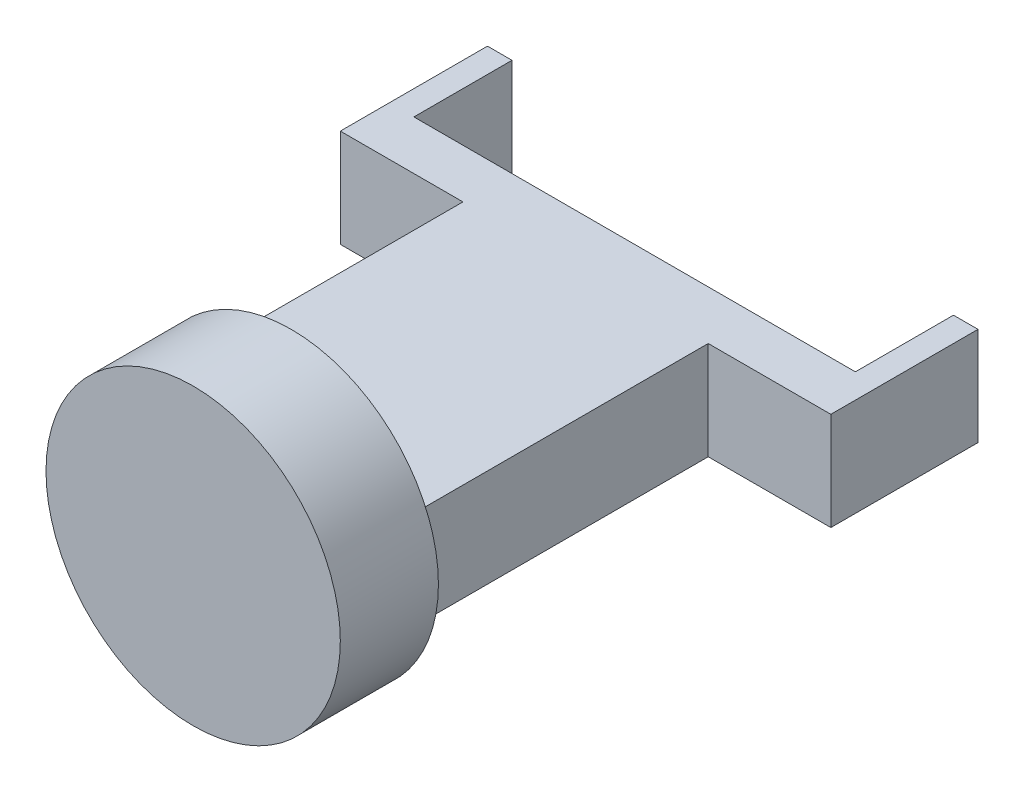
ISO-10303-21;
HEADER;
FILE_DESCRIPTION(('STEP AP214'),'2;1');
FILE_NAME('part.step','',(''),(''),'','','');
FILE_SCHEMA(('AUTOMOTIVE_DESIGN { 1 0 10303 214 1 1 1 1 }'));
ENDSEC;
DATA;
#1=APPLICATION_CONTEXT('core data for automotive mechanical design processes');
#2=APPLICATION_PROTOCOL_DEFINITION('international standard','automotive_design',2000,#1);
#3=PRODUCT_CONTEXT('',#1,'mechanical');
#4=PRODUCT('Part','Part','',(#3));
#5=PRODUCT_RELATED_PRODUCT_CATEGORY('part','',(#4));
#6=PRODUCT_DEFINITION_FORMATION('','',#4);
#7=PRODUCT_DEFINITION_CONTEXT('part definition',#1,'design');
#8=PRODUCT_DEFINITION('design','',#6,#7);
#9=PRODUCT_DEFINITION_SHAPE('','',#8);
#10=(LENGTH_UNIT() NAMED_UNIT(*) SI_UNIT(.MILLI.,.METRE.));
#11=(NAMED_UNIT(*) PLANE_ANGLE_UNIT() SI_UNIT($,.RADIAN.));
#12=(NAMED_UNIT(*) SI_UNIT($,.STERADIAN.) SOLID_ANGLE_UNIT());
#13=UNCERTAINTY_MEASURE_WITH_UNIT(LENGTH_MEASURE(1.E-05),#10,'distance_accuracy_value','');
#14=(GEOMETRIC_REPRESENTATION_CONTEXT(3) GLOBAL_UNCERTAINTY_ASSIGNED_CONTEXT((#13)) GLOBAL_UNIT_ASSIGNED_CONTEXT((#10,
#11,#12)) REPRESENTATION_CONTEXT('',''));
#15=CARTESIAN_POINT('',(0.,0.,0.));
#16=DIRECTION('',(0.,0.,1.));
#17=DIRECTION('',(1.,0.,0.));
#18=AXIS2_PLACEMENT_3D('',#15,#16,#17);
#19=CARTESIAN_POINT('',(0.,0.,-90.));
#20=DIRECTION('',(0.,0.,1.));
#21=DIRECTION('',(1.,0.,0.));
#22=AXIS2_PLACEMENT_3D('',#19,#20,#21);
#23=PLANE('',#22);
#24=DIRECTION('',(0.,-1.,0.));
#25=VECTOR('',#24,1.);
#26=CARTESIAN_POINT('',(-45.,-10.,-90.));
#27=LINE('',#26,#25);
#28=CARTESIAN_POINT('',(-45.,10.,-90.));
#29=VERTEX_POINT('',#28);
#30=CARTESIAN_POINT('',(-45.,-10.,-90.));
#31=VERTEX_POINT('',#30);
#32=EDGE_CURVE('E48',#29,#31,#27,.T.);
#33=ORIENTED_EDGE('',*,*,#32,.F.);
#34=DIRECTION('',(1.,0.,0.));
#35=VECTOR('',#34,1.);
#36=CARTESIAN_POINT('',(50.,10.,-90.));
#37=LINE('',#36,#35);
#38=CARTESIAN_POINT('',(45.,10.,-90.));
#39=VERTEX_POINT('',#38);
#40=EDGE_CURVE('E176',#29,#39,#37,.T.);
#41=ORIENTED_EDGE('',*,*,#40,.T.);
#42=DIRECTION('',(0.,1.,0.));
#43=VECTOR('',#42,1.);
#44=CARTESIAN_POINT('',(45.,-10.,-90.));
#45=LINE('',#44,#43);
#46=CARTESIAN_POINT('',(45.,-10.,-90.));
#47=VERTEX_POINT('',#46);
#48=EDGE_CURVE('E157',#47,#39,#45,.T.);
#49=ORIENTED_EDGE('',*,*,#48,.F.);
#50=DIRECTION('',(-1.,0.,0.));
#51=VECTOR('',#50,1.);
#52=CARTESIAN_POINT('',(50.,-10.,-90.));
#53=LINE('',#52,#51);
#54=EDGE_CURVE('E53',#47,#31,#53,.T.);
#55=ORIENTED_EDGE('',*,*,#54,.T.);
#56=EDGE_LOOP('',(#33,#41,#49,#55));
#57=FACE_BOUND('',#56,.T.);
#58=ADVANCED_FACE('F33',(#57),#23,.F.);
#59=CARTESIAN_POINT('',(0.,0.,-20.));
#60=DIRECTION('',(0.,0.,1.));
#61=DIRECTION('',(1.,0.,0.));
#62=AXIS2_PLACEMENT_3D('',#59,#60,#61);
#63=PLANE('',#62);
#64=CARTESIAN_POINT('',(0.,0.,-20.));
#65=DIRECTION('',(0.,0.,1.));
#66=DIRECTION('',(1.,0.,0.));
#67=AXIS2_PLACEMENT_3D('',#64,#65,#66);
#68=CIRCLE('',#67,30.);
#69=CARTESIAN_POINT('',(30.,0.,-20.));
#70=VERTEX_POINT('',#69);
#71=EDGE_CURVE('E11',#70,#70,#68,.T.);
#72=ORIENTED_EDGE('',*,*,#71,.F.);
#73=EDGE_LOOP('',(#72));
#74=FACE_BOUND('',#73,.T.);
#75=DIRECTION('',(0.,1.,0.));
#76=VECTOR('',#75,1.);
#77=CARTESIAN_POINT('',(-25.,-10.,-20.));
#78=LINE('',#77,#76);
#79=CARTESIAN_POINT('',(-25.,-10.,-20.));
#80=VERTEX_POINT('',#79);
#81=CARTESIAN_POINT('',(-25.,10.,-20.));
#82=VERTEX_POINT('',#81);
#83=EDGE_CURVE('E131',#80,#82,#78,.T.);
#84=ORIENTED_EDGE('',*,*,#83,.F.);
#85=DIRECTION('',(-1.,0.,0.));
#86=VECTOR('',#85,1.);
#87=CARTESIAN_POINT('',(25.,-10.,-20.));
#88=LINE('',#87,#86);
#89=CARTESIAN_POINT('',(25.,-10.,-20.));
#90=VERTEX_POINT('',#89);
#91=EDGE_CURVE('E200',#90,#80,#88,.T.);
#92=ORIENTED_EDGE('',*,*,#91,.F.);
#93=DIRECTION('',(0.,-1.,0.));
#94=VECTOR('',#93,1.);
#95=CARTESIAN_POINT('',(25.,-10.,-20.));
#96=LINE('',#95,#94);
#97=CARTESIAN_POINT('',(25.,10.,-20.));
#98=VERTEX_POINT('',#97);
#99=EDGE_CURVE('E208',#98,#90,#96,.T.);
#100=ORIENTED_EDGE('',*,*,#99,.F.);
#101=DIRECTION('',(1.,0.,0.));
#102=VECTOR('',#101,1.);
#103=CARTESIAN_POINT('',(25.,10.,-20.));
#104=LINE('',#103,#102);
#105=EDGE_CURVE('E206',#82,#98,#104,.T.);
#106=ORIENTED_EDGE('',*,*,#105,.F.);
#107=EDGE_LOOP('',(#84,#92,#100,#106));
#108=FACE_BOUND('',#107,.T.);
#109=ADVANCED_FACE('F229',(#74,#108),#63,.F.);
#110=CARTESIAN_POINT('',(0.,0.,-20.));
#111=DIRECTION('',(0.,0.,1.));
#112=DIRECTION('',(1.,0.,0.));
#113=AXIS2_PLACEMENT_3D('',#110,#111,#112);
#114=CYLINDRICAL_SURFACE('',#113,30.);
#115=ORIENTED_EDGE('',*,*,#71,.T.);
#116=EDGE_LOOP('',(#115));
#117=FACE_BOUND('',#116,.T.);
#118=CARTESIAN_POINT('',(0.,0.,0.));
#119=DIRECTION('',(0.,0.,1.));
#120=DIRECTION('',(1.,0.,0.));
#121=AXIS2_PLACEMENT_3D('',#118,#119,#120);
#122=CIRCLE('',#121,30.);
#123=CARTESIAN_POINT('',(30.,0.,0.));
#124=VERTEX_POINT('',#123);
#125=EDGE_CURVE('E37',#124,#124,#122,.T.);
#126=ORIENTED_EDGE('',*,*,#125,.F.);
#127=EDGE_LOOP('',(#126));
#128=FACE_BOUND('',#127,.T.);
#129=ADVANCED_FACE('F35',(#117,#128),#114,.T.);
#130=CARTESIAN_POINT('',(0.,0.,0.));
#131=DIRECTION('',(0.,0.,1.));
#132=DIRECTION('',(1.,0.,0.));
#133=AXIS2_PLACEMENT_3D('',#130,#131,#132);
#134=PLANE('',#133);
#135=ORIENTED_EDGE('',*,*,#125,.T.);
#136=EDGE_LOOP('',(#135));
#137=FACE_BOUND('',#136,.T.);
#138=ADVANCED_FACE('F226',(#137),#134,.T.);
#139=CARTESIAN_POINT('',(-25.,-10.,-80.));
#140=DIRECTION('',(1.,0.,0.));
#141=DIRECTION('',(0.,0.,-1.));
#142=AXIS2_PLACEMENT_3D('',#139,#140,#141);
#143=PLANE('',#142);
#144=ORIENTED_EDGE('',*,*,#83,.T.);
#145=DIRECTION('',(0.,0.,1.));
#146=VECTOR('',#145,1.);
#147=CARTESIAN_POINT('',(-25.,10.,-80.));
#148=LINE('',#147,#146);
#149=CARTESIAN_POINT('',(-25.,10.,-80.));
#150=VERTEX_POINT('',#149);
#151=EDGE_CURVE('E221',#150,#82,#148,.T.);
#152=ORIENTED_EDGE('',*,*,#151,.F.);
#153=DIRECTION('',(0.,1.,0.));
#154=VECTOR('',#153,1.);
#155=CARTESIAN_POINT('',(-25.,-10.,-80.));
#156=LINE('',#155,#154);
#157=CARTESIAN_POINT('',(-25.,-10.,-80.));
#158=VERTEX_POINT('',#157);
#159=EDGE_CURVE('E196',#158,#150,#156,.T.);
#160=ORIENTED_EDGE('',*,*,#159,.F.);
#161=DIRECTION('',(0.,0.,1.));
#162=VECTOR('',#161,1.);
#163=CARTESIAN_POINT('',(-25.,-10.,-80.));
#164=LINE('',#163,#162);
#165=EDGE_CURVE('E203',#158,#80,#164,.T.);
#166=ORIENTED_EDGE('',*,*,#165,.T.);
#167=EDGE_LOOP('',(#144,#152,#160,#166));
#168=FACE_BOUND('',#167,.T.);
#169=ADVANCED_FACE('F235',(#168),#143,.F.);
#170=CARTESIAN_POINT('',(25.,10.,-80.));
#171=DIRECTION('',(0.,-1.,0.));
#172=DIRECTION('',(0.,0.,-1.));
#173=AXIS2_PLACEMENT_3D('',#170,#171,#172);
#174=PLANE('',#173);
#175=ORIENTED_EDGE('',*,*,#105,.T.);
#176=DIRECTION('',(0.,0.,1.));
#177=VECTOR('',#176,1.);
#178=CARTESIAN_POINT('',(25.,10.,-80.));
#179=LINE('',#178,#177);
#180=CARTESIAN_POINT('',(25.,10.,-80.));
#181=VERTEX_POINT('',#180);
#182=EDGE_CURVE('E218',#181,#98,#179,.T.);
#183=ORIENTED_EDGE('',*,*,#182,.F.);
#184=DIRECTION('',(1.,0.,0.));
#185=VECTOR('',#184,1.);
#186=CARTESIAN_POINT('',(50.,10.,-80.));
#187=LINE('',#186,#185);
#188=CARTESIAN_POINT('',(50.,10.,-80.));
#189=VERTEX_POINT('',#188);
#190=EDGE_CURVE('E182',#181,#189,#187,.T.);
#191=ORIENTED_EDGE('',*,*,#190,.T.);
#192=DIRECTION('',(0.,0.,1.));
#193=VECTOR('',#192,1.);
#194=CARTESIAN_POINT('',(50.,10.,-90.));
#195=LINE('',#194,#193);
#196=CARTESIAN_POINT('',(50.,10.,-110.));
#197=VERTEX_POINT('',#196);
#198=EDGE_CURVE('E132',#197,#189,#195,.T.);
#199=ORIENTED_EDGE('',*,*,#198,.F.);
#200=DIRECTION('',(1.,0.,0.));
#201=VECTOR('',#200,1.);
#202=CARTESIAN_POINT('',(45.,10.,-110.));
#203=LINE('',#202,#201);
#204=CARTESIAN_POINT('',(45.,10.,-110.));
#205=VERTEX_POINT('',#204);
#206=EDGE_CURVE('E165',#205,#197,#203,.T.);
#207=ORIENTED_EDGE('',*,*,#206,.F.);
#208=DIRECTION('',(0.,0.,1.));
#209=VECTOR('',#208,1.);
#210=CARTESIAN_POINT('',(45.,10.,-110.));
#211=LINE('',#210,#209);
#212=EDGE_CURVE('E168',#205,#39,#211,.T.);
#213=ORIENTED_EDGE('',*,*,#212,.T.);
#214=ORIENTED_EDGE('',*,*,#40,.F.);
#215=DIRECTION('',(0.,0.,1.));
#216=VECTOR('',#215,1.);
#217=CARTESIAN_POINT('',(-45.,10.,-110.));
#218=LINE('',#217,#216);
#219=CARTESIAN_POINT('',(-45.,10.,-110.));
#220=VERTEX_POINT('',#219);
#221=EDGE_CURVE('E139',#220,#29,#218,.T.);
#222=ORIENTED_EDGE('',*,*,#221,.F.);
#223=DIRECTION('',(1.,0.,0.));
#224=VECTOR('',#223,1.);
#225=CARTESIAN_POINT('',(-45.,10.,-110.));
#226=LINE('',#225,#224);
#227=CARTESIAN_POINT('',(-50.,10.,-110.));
#228=VERTEX_POINT('',#227);
#229=EDGE_CURVE('E135',#228,#220,#226,.T.);
#230=ORIENTED_EDGE('',*,*,#229,.F.);
#231=DIRECTION('',(0.,0.,1.));
#232=VECTOR('',#231,1.);
#233=CARTESIAN_POINT('',(-50.,10.,-90.));
#234=LINE('',#233,#232);
#235=CARTESIAN_POINT('',(-50.,10.,-80.));
#236=VERTEX_POINT('',#235);
#237=EDGE_CURVE('E121',#228,#236,#234,.T.);
#238=ORIENTED_EDGE('',*,*,#237,.T.);
#239=EDGE_CURVE('E183',#236,#150,#187,.T.);
#240=ORIENTED_EDGE('',*,*,#239,.T.);
#241=ORIENTED_EDGE('',*,*,#151,.T.);
#242=EDGE_LOOP('',(#175,#183,#191,#199,#207,#213,#214,#222,#230,#238,#240,#241));
#243=FACE_BOUND('',#242,.T.);
#244=ADVANCED_FACE('F137',(#243),#174,.F.);
#245=CARTESIAN_POINT('',(25.,-10.,-80.));
#246=DIRECTION('',(-1.,0.,0.));
#247=DIRECTION('',(0.,0.,1.));
#248=AXIS2_PLACEMENT_3D('',#245,#246,#247);
#249=PLANE('',#248);
#250=ORIENTED_EDGE('',*,*,#99,.T.);
#251=DIRECTION('',(0.,0.,1.));
#252=VECTOR('',#251,1.);
#253=CARTESIAN_POINT('',(25.,-10.,-80.));
#254=LINE('',#253,#252);
#255=CARTESIAN_POINT('',(25.,-10.,-80.));
#256=VERTEX_POINT('',#255);
#257=EDGE_CURVE('E215',#256,#90,#254,.T.);
#258=ORIENTED_EDGE('',*,*,#257,.F.);
#259=DIRECTION('',(0.,-1.,0.));
#260=VECTOR('',#259,1.);
#261=CARTESIAN_POINT('',(25.,-10.,-80.));
#262=LINE('',#261,#260);
#263=EDGE_CURVE('E199',#181,#256,#262,.T.);
#264=ORIENTED_EDGE('',*,*,#263,.F.);
#265=ORIENTED_EDGE('',*,*,#182,.T.);
#266=EDGE_LOOP('',(#250,#258,#264,#265));
#267=FACE_BOUND('',#266,.T.);
#268=ADVANCED_FACE('F260',(#267),#249,.F.);
#269=CARTESIAN_POINT('',(25.,-10.,-80.));
#270=DIRECTION('',(0.,1.,0.));
#271=DIRECTION('',(0.,0.,1.));
#272=AXIS2_PLACEMENT_3D('',#269,#270,#271);
#273=PLANE('',#272);
#274=ORIENTED_EDGE('',*,*,#91,.T.);
#275=ORIENTED_EDGE('',*,*,#165,.F.);
#276=DIRECTION('',(-1.,0.,0.));
#277=VECTOR('',#276,1.);
#278=CARTESIAN_POINT('',(50.,-10.,-80.));
#279=LINE('',#278,#277);
#280=CARTESIAN_POINT('',(-50.,-10.,-80.));
#281=VERTEX_POINT('',#280);
#282=EDGE_CURVE('E187',#158,#281,#279,.T.);
#283=ORIENTED_EDGE('',*,*,#282,.T.);
#284=DIRECTION('',(0.,0.,1.));
#285=VECTOR('',#284,1.);
#286=CARTESIAN_POINT('',(-50.,-10.,-90.));
#287=LINE('',#286,#285);
#288=CARTESIAN_POINT('',(-50.,-10.,-110.));
#289=VERTEX_POINT('',#288);
#290=EDGE_CURVE('E180',#289,#281,#287,.T.);
#291=ORIENTED_EDGE('',*,*,#290,.F.);
#292=DIRECTION('',(-1.,0.,0.));
#293=VECTOR('',#292,1.);
#294=CARTESIAN_POINT('',(-50.,-10.,-110.));
#295=LINE('',#294,#293);
#296=CARTESIAN_POINT('',(-45.,-10.,-110.));
#297=VERTEX_POINT('',#296);
#298=EDGE_CURVE('E147',#297,#289,#295,.T.);
#299=ORIENTED_EDGE('',*,*,#298,.F.);
#300=DIRECTION('',(0.,0.,1.));
#301=VECTOR('',#300,1.);
#302=CARTESIAN_POINT('',(-45.,-10.,-110.));
#303=LINE('',#302,#301);
#304=EDGE_CURVE('E152',#297,#31,#303,.T.);
#305=ORIENTED_EDGE('',*,*,#304,.T.);
#306=ORIENTED_EDGE('',*,*,#54,.F.);
#307=DIRECTION('',(0.,0.,1.));
#308=VECTOR('',#307,1.);
#309=CARTESIAN_POINT('',(45.,-10.,-110.));
#310=LINE('',#309,#308);
#311=CARTESIAN_POINT('',(45.,-10.,-110.));
#312=VERTEX_POINT('',#311);
#313=EDGE_CURVE('E173',#312,#47,#310,.T.);
#314=ORIENTED_EDGE('',*,*,#313,.F.);
#315=DIRECTION('',(-1.,0.,0.));
#316=VECTOR('',#315,1.);
#317=CARTESIAN_POINT('',(50.,-10.,-110.));
#318=LINE('',#317,#316);
#319=CARTESIAN_POINT('',(50.,-10.,-110.));
#320=VERTEX_POINT('',#319);
#321=EDGE_CURVE('E161',#320,#312,#318,.T.);
#322=ORIENTED_EDGE('',*,*,#321,.F.);
#323=DIRECTION('',(0.,0.,1.));
#324=VECTOR('',#323,1.);
#325=CARTESIAN_POINT('',(50.,-10.,-90.));
#326=LINE('',#325,#324);
#327=CARTESIAN_POINT('',(50.,-10.,-80.));
#328=VERTEX_POINT('',#327);
#329=EDGE_CURVE('E191',#320,#328,#326,.T.);
#330=ORIENTED_EDGE('',*,*,#329,.T.);
#331=EDGE_CURVE('E178',#328,#256,#279,.T.);
#332=ORIENTED_EDGE('',*,*,#331,.T.);
#333=ORIENTED_EDGE('',*,*,#257,.T.);
#334=EDGE_LOOP('',(#274,#275,#283,#291,#299,#305,#306,#314,#322,#330,#332,#333));
#335=FACE_BOUND('',#334,.T.);
#336=ADVANCED_FACE('F257',(#335),#273,.F.);
#337=CARTESIAN_POINT('',(0.,0.,-80.));
#338=DIRECTION('',(0.,0.,1.));
#339=DIRECTION('',(1.,0.,0.));
#340=AXIS2_PLACEMENT_3D('',#337,#338,#339);
#341=PLANE('',#340);
#342=ORIENTED_EDGE('',*,*,#282,.F.);
#343=ORIENTED_EDGE('',*,*,#159,.T.);
#344=ORIENTED_EDGE('',*,*,#239,.F.);
#345=DIRECTION('',(0.,1.,0.));
#346=VECTOR('',#345,1.);
#347=CARTESIAN_POINT('',(-50.,-10.,-80.));
#348=LINE('',#347,#346);
#349=EDGE_CURVE('E128',#281,#236,#348,.T.);
#350=ORIENTED_EDGE('',*,*,#349,.F.);
#351=EDGE_LOOP('',(#342,#343,#344,#350));
#352=FACE_BOUND('',#351,.T.);
#353=ADVANCED_FACE('F251',(#352),#341,.T.);
#354=CARTESIAN_POINT('',(-50.,-10.,-90.));
#355=DIRECTION('',(1.,0.,0.));
#356=DIRECTION('',(0.,0.,-1.));
#357=AXIS2_PLACEMENT_3D('',#354,#355,#356);
#358=PLANE('',#357);
#359=ORIENTED_EDGE('',*,*,#349,.T.);
#360=ORIENTED_EDGE('',*,*,#237,.F.);
#361=DIRECTION('',(0.,1.,0.));
#362=VECTOR('',#361,1.);
#363=CARTESIAN_POINT('',(-50.,10.,-110.));
#364=LINE('',#363,#362);
#365=EDGE_CURVE('E126',#289,#228,#364,.T.);
#366=ORIENTED_EDGE('',*,*,#365,.F.);
#367=ORIENTED_EDGE('',*,*,#290,.T.);
#368=EDGE_LOOP('',(#359,#360,#366,#367));
#369=FACE_BOUND('',#368,.T.);
#370=ADVANCED_FACE('F123',(#369),#358,.F.);
#371=CARTESIAN_POINT('',(50.,-10.,-90.));
#372=DIRECTION('',(-1.,0.,0.));
#373=DIRECTION('',(0.,0.,1.));
#374=AXIS2_PLACEMENT_3D('',#371,#372,#373);
#375=PLANE('',#374);
#376=DIRECTION('',(0.,-1.,0.));
#377=VECTOR('',#376,1.);
#378=CARTESIAN_POINT('',(50.,-10.,-80.));
#379=LINE('',#378,#377);
#380=EDGE_CURVE('E185',#189,#328,#379,.T.);
#381=ORIENTED_EDGE('',*,*,#380,.T.);
#382=ORIENTED_EDGE('',*,*,#329,.F.);
#383=DIRECTION('',(0.,-1.,0.));
#384=VECTOR('',#383,1.);
#385=CARTESIAN_POINT('',(50.,10.,-110.));
#386=LINE('',#385,#384);
#387=EDGE_CURVE('E158',#197,#320,#386,.T.);
#388=ORIENTED_EDGE('',*,*,#387,.F.);
#389=ORIENTED_EDGE('',*,*,#198,.T.);
#390=EDGE_LOOP('',(#381,#382,#388,#389));
#391=FACE_BOUND('',#390,.T.);
#392=ADVANCED_FACE('F249',(#391),#375,.F.);
#393=ORIENTED_EDGE('',*,*,#190,.F.);
#394=ORIENTED_EDGE('',*,*,#263,.T.);
#395=ORIENTED_EDGE('',*,*,#331,.F.);
#396=ORIENTED_EDGE('',*,*,#380,.F.);
#397=EDGE_LOOP('',(#393,#394,#395,#396));
#398=FACE_BOUND('',#397,.T.);
#399=ADVANCED_FACE('F246',(#398),#341,.T.);
#400=CARTESIAN_POINT('',(45.,-10.,-110.));
#401=DIRECTION('',(1.,0.,0.));
#402=DIRECTION('',(0.,0.,-1.));
#403=AXIS2_PLACEMENT_3D('',#400,#401,#402);
#404=PLANE('',#403);
#405=ORIENTED_EDGE('',*,*,#48,.T.);
#406=ORIENTED_EDGE('',*,*,#212,.F.);
#407=DIRECTION('',(0.,1.,0.));
#408=VECTOR('',#407,1.);
#409=CARTESIAN_POINT('',(45.,-10.,-110.));
#410=LINE('',#409,#408);
#411=EDGE_CURVE('E163',#312,#205,#410,.T.);
#412=ORIENTED_EDGE('',*,*,#411,.F.);
#413=ORIENTED_EDGE('',*,*,#313,.T.);
#414=EDGE_LOOP('',(#405,#406,#412,#413));
#415=FACE_BOUND('',#414,.T.);
#416=ADVANCED_FACE('F244',(#415),#404,.F.);
#417=CARTESIAN_POINT('',(0.,0.,-110.));
#418=DIRECTION('',(0.,0.,-1.));
#419=DIRECTION('',(-1.,0.,0.));
#420=AXIS2_PLACEMENT_3D('',#417,#418,#419);
#421=PLANE('',#420);
#422=ORIENTED_EDGE('',*,*,#387,.T.);
#423=ORIENTED_EDGE('',*,*,#321,.T.);
#424=ORIENTED_EDGE('',*,*,#411,.T.);
#425=ORIENTED_EDGE('',*,*,#206,.T.);
#426=EDGE_LOOP('',(#422,#423,#424,#425));
#427=FACE_BOUND('',#426,.T.);
#428=ADVANCED_FACE('F281',(#427),#421,.T.);
#429=CARTESIAN_POINT('',(-45.,-10.,-110.));
#430=DIRECTION('',(-1.,0.,0.));
#431=DIRECTION('',(0.,0.,1.));
#432=AXIS2_PLACEMENT_3D('',#429,#430,#431);
#433=PLANE('',#432);
#434=ORIENTED_EDGE('',*,*,#32,.T.);
#435=ORIENTED_EDGE('',*,*,#304,.F.);
#436=DIRECTION('',(0.,-1.,0.));
#437=VECTOR('',#436,1.);
#438=CARTESIAN_POINT('',(-45.,-10.,-110.));
#439=LINE('',#438,#437);
#440=EDGE_CURVE('E142',#220,#297,#439,.T.);
#441=ORIENTED_EDGE('',*,*,#440,.F.);
#442=ORIENTED_EDGE('',*,*,#221,.T.);
#443=EDGE_LOOP('',(#434,#435,#441,#442));
#444=FACE_BOUND('',#443,.T.);
#445=ADVANCED_FACE('F288',(#444),#433,.F.);
#446=CARTESIAN_POINT('',(0.,0.,-110.));
#447=DIRECTION('',(0.,0.,1.));
#448=DIRECTION('',(1.,0.,0.));
#449=AXIS2_PLACEMENT_3D('',#446,#447,#448);
#450=PLANE('',#449);
#451=ORIENTED_EDGE('',*,*,#365,.T.);
#452=ORIENTED_EDGE('',*,*,#229,.T.);
#453=ORIENTED_EDGE('',*,*,#440,.T.);
#454=ORIENTED_EDGE('',*,*,#298,.T.);
#455=EDGE_LOOP('',(#451,#452,#453,#454));
#456=FACE_BOUND('',#455,.T.);
#457=ADVANCED_FACE('F145',(#456),#450,.F.);
#458=CLOSED_SHELL('',(#58,#109,#129,#138,#169,#244,#268,#336,#353,#370,#392,#399,#416,#428,#445,#457));
#459=MANIFOLD_SOLID_BREP('B2',#458);
#460=ADVANCED_BREP_SHAPE_REPRESENTATION('',(#18,#459),#14);
#461=SHAPE_DEFINITION_REPRESENTATION(#9,#460);
ENDSEC;
END-ISO-10303-21;
